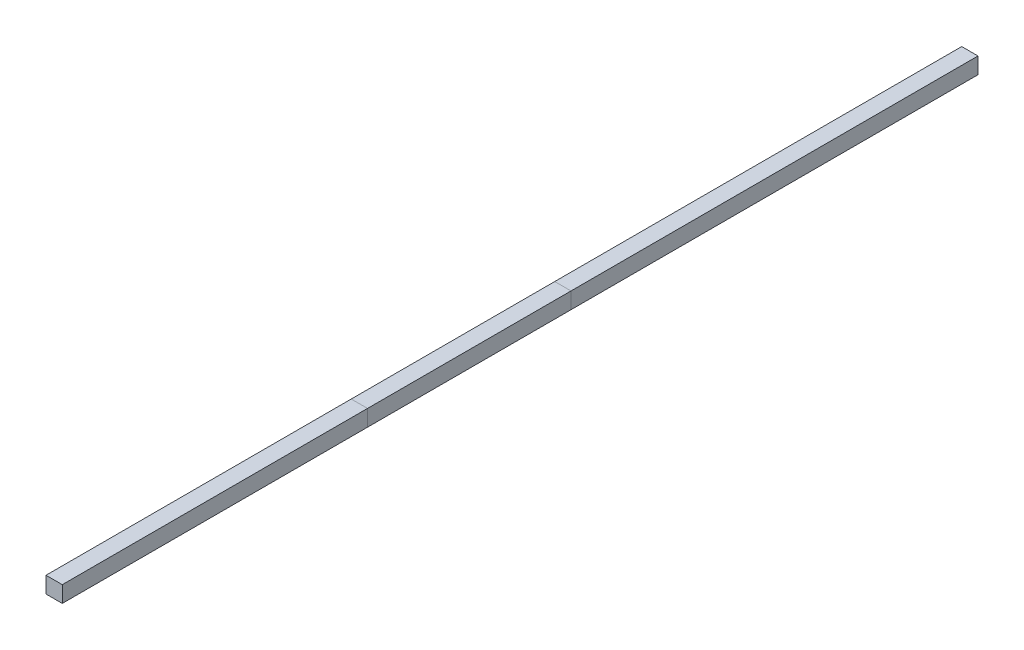
ISO-10303-21;
HEADER;
FILE_DESCRIPTION(('STEP AP214'),'2;1');
FILE_NAME('part.step','',(''),(''),'','','');
FILE_SCHEMA(('AUTOMOTIVE_DESIGN { 1 0 10303 214 1 1 1 1 }'));
ENDSEC;
DATA;
#1=APPLICATION_CONTEXT('core data for automotive mechanical design processes');
#2=APPLICATION_PROTOCOL_DEFINITION('international standard','automotive_design',2000,#1);
#3=PRODUCT_CONTEXT('',#1,'mechanical');
#4=PRODUCT('Part','Part','',(#3));
#5=PRODUCT_RELATED_PRODUCT_CATEGORY('part','',(#4));
#6=PRODUCT_DEFINITION_FORMATION('','',#4);
#7=PRODUCT_DEFINITION_CONTEXT('part definition',#1,'design');
#8=PRODUCT_DEFINITION('design','',#6,#7);
#9=PRODUCT_DEFINITION_SHAPE('','',#8);
#10=(LENGTH_UNIT() NAMED_UNIT(*) SI_UNIT(.MILLI.,.METRE.));
#11=(NAMED_UNIT(*) PLANE_ANGLE_UNIT() SI_UNIT($,.RADIAN.));
#12=(NAMED_UNIT(*) SI_UNIT($,.STERADIAN.) SOLID_ANGLE_UNIT());
#13=UNCERTAINTY_MEASURE_WITH_UNIT(LENGTH_MEASURE(1.E-05),#10,'distance_accuracy_value','');
#14=(GEOMETRIC_REPRESENTATION_CONTEXT(3) GLOBAL_UNCERTAINTY_ASSIGNED_CONTEXT((#13)) GLOBAL_UNIT_ASSIGNED_CONTEXT((#10,
#11,#12)) REPRESENTATION_CONTEXT('',''));
#15=CARTESIAN_POINT('',(0.,0.,0.));
#16=DIRECTION('',(0.,0.,1.));
#17=DIRECTION('',(1.,0.,0.));
#18=AXIS2_PLACEMENT_3D('',#15,#16,#17);
#19=CARTESIAN_POINT('',(0.,0.,4500.));
#20=DIRECTION('',(1.,0.,0.));
#21=DIRECTION('',(0.,1.,0.));
#22=AXIS2_PLACEMENT_3D('',#19,#20,#21);
#23=PLANE('',#22);
#24=DIRECTION('',(0.,-1.,0.));
#25=VECTOR('',#24,1.);
#26=CARTESIAN_POINT('',(0.,0.,3000.));
#27=LINE('',#26,#25);
#28=CARTESIAN_POINT('',(0.,80.,3000.));
#29=VERTEX_POINT('',#28);
#30=CARTESIAN_POINT('',(0.,0.,3000.));
#31=VERTEX_POINT('',#30);
#32=EDGE_CURVE('E113',#29,#31,#27,.T.);
#33=ORIENTED_EDGE('',*,*,#32,.T.);
#34=DIRECTION('',(0.,0.,-1.));
#35=VECTOR('',#34,1.);
#36=CARTESIAN_POINT('',(0.,0.,4500.));
#37=LINE('',#36,#35);
#38=CARTESIAN_POINT('',(0.,0.,4500.));
#39=VERTEX_POINT('',#38);
#40=EDGE_CURVE('E12',#39,#31,#37,.T.);
#41=ORIENTED_EDGE('',*,*,#40,.F.);
#42=DIRECTION('',(0.,-1.,0.));
#43=VECTOR('',#42,1.);
#44=CARTESIAN_POINT('',(0.,0.,4500.));
#45=LINE('',#44,#43);
#46=CARTESIAN_POINT('',(0.,80.,4500.));
#47=VERTEX_POINT('',#46);
#48=EDGE_CURVE('E101',#47,#39,#45,.T.);
#49=ORIENTED_EDGE('',*,*,#48,.F.);
#50=DIRECTION('',(0.,0.,-1.));
#51=VECTOR('',#50,1.);
#52=CARTESIAN_POINT('',(0.,80.,4500.));
#53=LINE('',#52,#51);
#54=EDGE_CURVE('E109',#47,#29,#53,.T.);
#55=ORIENTED_EDGE('',*,*,#54,.T.);
#56=EDGE_LOOP('',(#33,#41,#49,#55));
#57=FACE_BOUND('',#56,.T.);
#58=ADVANCED_FACE('F50',(#57),#23,.F.);
#59=CARTESIAN_POINT('',(0.,0.,4500.));
#60=DIRECTION('',(0.,1.,0.));
#61=DIRECTION('',(0.,0.,1.));
#62=AXIS2_PLACEMENT_3D('',#59,#60,#61);
#63=PLANE('',#62);
#64=DIRECTION('',(1.,0.,0.));
#65=VECTOR('',#64,1.);
#66=CARTESIAN_POINT('',(0.,0.,3000.));
#67=LINE('',#66,#65);
#68=CARTESIAN_POINT('',(80.,0.,3000.));
#69=VERTEX_POINT('',#68);
#70=EDGE_CURVE('E105',#31,#69,#67,.T.);
#71=ORIENTED_EDGE('',*,*,#70,.T.);
#72=DIRECTION('',(0.,0.,-1.));
#73=VECTOR('',#72,1.);
#74=CARTESIAN_POINT('',(80.,0.,4500.));
#75=LINE('',#74,#73);
#76=CARTESIAN_POINT('',(80.,0.,4500.));
#77=VERTEX_POINT('',#76);
#78=EDGE_CURVE('E58',#77,#69,#75,.T.);
#79=ORIENTED_EDGE('',*,*,#78,.F.);
#80=DIRECTION('',(1.,0.,0.));
#81=VECTOR('',#80,1.);
#82=CARTESIAN_POINT('',(0.,0.,4500.));
#83=LINE('',#82,#81);
#84=EDGE_CURVE('E96',#39,#77,#83,.T.);
#85=ORIENTED_EDGE('',*,*,#84,.F.);
#86=ORIENTED_EDGE('',*,*,#40,.T.);
#87=EDGE_LOOP('',(#71,#79,#85,#86));
#88=FACE_BOUND('',#87,.T.);
#89=ADVANCED_FACE('F104',(#88),#63,.F.);
#90=CARTESIAN_POINT('',(80.,0.,4500.));
#91=DIRECTION('',(-1.,0.,0.));
#92=DIRECTION('',(0.,-1.,0.));
#93=AXIS2_PLACEMENT_3D('',#90,#91,#92);
#94=PLANE('',#93);
#95=DIRECTION('',(0.,1.,0.));
#96=VECTOR('',#95,1.);
#97=CARTESIAN_POINT('',(80.,0.,3000.));
#98=LINE('',#97,#96);
#99=CARTESIAN_POINT('',(80.,80.,3000.));
#100=VERTEX_POINT('',#99);
#101=EDGE_CURVE('E83',#69,#100,#98,.T.);
#102=ORIENTED_EDGE('',*,*,#101,.T.);
#103=DIRECTION('',(0.,0.,-1.));
#104=VECTOR('',#103,1.);
#105=CARTESIAN_POINT('',(80.,80.,4500.));
#106=LINE('',#105,#104);
#107=CARTESIAN_POINT('',(80.,80.,4500.));
#108=VERTEX_POINT('',#107);
#109=EDGE_CURVE('E106',#108,#100,#106,.T.);
#110=ORIENTED_EDGE('',*,*,#109,.F.);
#111=DIRECTION('',(0.,1.,0.));
#112=VECTOR('',#111,1.);
#113=CARTESIAN_POINT('',(80.,0.,4500.));
#114=LINE('',#113,#112);
#115=EDGE_CURVE('E99',#77,#108,#114,.T.);
#116=ORIENTED_EDGE('',*,*,#115,.F.);
#117=ORIENTED_EDGE('',*,*,#78,.T.);
#118=EDGE_LOOP('',(#102,#110,#116,#117));
#119=FACE_BOUND('',#118,.T.);
#120=ADVANCED_FACE('F107',(#119),#94,.F.);
#121=CARTESIAN_POINT('',(0.,80.,4500.));
#122=DIRECTION('',(0.,-1.,0.));
#123=DIRECTION('',(0.,0.,-1.));
#124=AXIS2_PLACEMENT_3D('',#121,#122,#123);
#125=PLANE('',#124);
#126=DIRECTION('',(-1.,0.,0.));
#127=VECTOR('',#126,1.);
#128=CARTESIAN_POINT('',(0.,80.,3000.));
#129=LINE('',#128,#127);
#130=EDGE_CURVE('E89',#100,#29,#129,.T.);
#131=ORIENTED_EDGE('',*,*,#130,.T.);
#132=ORIENTED_EDGE('',*,*,#54,.F.);
#133=DIRECTION('',(-1.,0.,0.));
#134=VECTOR('',#133,1.);
#135=CARTESIAN_POINT('',(0.,80.,4500.));
#136=LINE('',#135,#134);
#137=EDGE_CURVE('E66',#108,#47,#136,.T.);
#138=ORIENTED_EDGE('',*,*,#137,.F.);
#139=ORIENTED_EDGE('',*,*,#109,.T.);
#140=EDGE_LOOP('',(#131,#132,#138,#139));
#141=FACE_BOUND('',#140,.T.);
#142=ADVANCED_FACE('F120',(#141),#125,.F.);
#143=CARTESIAN_POINT('',(0.,0.,4500.));
#144=DIRECTION('',(0.,0.,-1.));
#145=DIRECTION('',(-1.,0.,0.));
#146=AXIS2_PLACEMENT_3D('',#143,#144,#145);
#147=PLANE('',#146);
#148=ORIENTED_EDGE('',*,*,#48,.T.);
#149=ORIENTED_EDGE('',*,*,#84,.T.);
#150=ORIENTED_EDGE('',*,*,#115,.T.);
#151=ORIENTED_EDGE('',*,*,#137,.T.);
#152=EDGE_LOOP('',(#148,#149,#150,#151));
#153=FACE_BOUND('',#152,.T.);
#154=ADVANCED_FACE('F97',(#153),#147,.F.);
#155=CARTESIAN_POINT('',(0.,0.,3000.));
#156=DIRECTION('',(0.,0.,-1.));
#157=DIRECTION('',(-1.,0.,0.));
#158=AXIS2_PLACEMENT_3D('',#155,#156,#157);
#159=PLANE('',#158);
#160=ORIENTED_EDGE('',*,*,#32,.F.);
#161=ORIENTED_EDGE('',*,*,#130,.F.);
#162=ORIENTED_EDGE('',*,*,#101,.F.);
#163=ORIENTED_EDGE('',*,*,#70,.F.);
#164=EDGE_LOOP('',(#160,#161,#162,#163));
#165=FACE_BOUND('',#164,.T.);
#166=ADVANCED_FACE('F123',(#165),#159,.T.);
#167=CLOSED_SHELL('',(#58,#89,#120,#142,#154,#166));
#168=MANIFOLD_SOLID_BREP('B2',#167);
#169=CARTESIAN_POINT('',(0.,0.,3000.));
#170=DIRECTION('',(1.,0.,0.));
#171=DIRECTION('',(0.,1.,0.));
#172=AXIS2_PLACEMENT_3D('',#169,#170,#171);
#173=PLANE('',#172);
#174=DIRECTION('',(0.,-1.,0.));
#175=VECTOR('',#174,1.);
#176=CARTESIAN_POINT('',(0.,0.,2000.));
#177=LINE('',#176,#175);
#178=CARTESIAN_POINT('',(0.,80.,2000.));
#179=VERTEX_POINT('',#178);
#180=CARTESIAN_POINT('',(0.,0.,2000.));
#181=VERTEX_POINT('',#180);
#182=EDGE_CURVE('E249',#179,#181,#177,.T.);
#183=ORIENTED_EDGE('',*,*,#182,.T.);
#184=DIRECTION('',(0.,0.,-1.));
#185=VECTOR('',#184,1.);
#186=CARTESIAN_POINT('',(0.,0.,3000.));
#187=LINE('',#186,#185);
#188=CARTESIAN_POINT('',(0.,0.,3000.));
#189=VERTEX_POINT('',#188);
#190=EDGE_CURVE('E48',#189,#181,#187,.T.);
#191=ORIENTED_EDGE('',*,*,#190,.F.);
#192=DIRECTION('',(0.,-1.,0.));
#193=VECTOR('',#192,1.);
#194=CARTESIAN_POINT('',(0.,0.,3000.));
#195=LINE('',#194,#193);
#196=CARTESIAN_POINT('',(0.,80.,3000.));
#197=VERTEX_POINT('',#196);
#198=EDGE_CURVE('E237',#197,#189,#195,.T.);
#199=ORIENTED_EDGE('',*,*,#198,.F.);
#200=DIRECTION('',(0.,0.,-1.));
#201=VECTOR('',#200,1.);
#202=CARTESIAN_POINT('',(0.,80.,3000.));
#203=LINE('',#202,#201);
#204=EDGE_CURVE('E245',#197,#179,#203,.T.);
#205=ORIENTED_EDGE('',*,*,#204,.T.);
#206=EDGE_LOOP('',(#183,#191,#199,#205));
#207=FACE_BOUND('',#206,.T.);
#208=ADVANCED_FACE('F185',(#207),#173,.F.);
#209=CARTESIAN_POINT('',(0.,0.,3000.));
#210=DIRECTION('',(0.,1.,0.));
#211=DIRECTION('',(0.,0.,1.));
#212=AXIS2_PLACEMENT_3D('',#209,#210,#211);
#213=PLANE('',#212);
#214=DIRECTION('',(1.,0.,0.));
#215=VECTOR('',#214,1.);
#216=CARTESIAN_POINT('',(0.,0.,2000.));
#217=LINE('',#216,#215);
#218=CARTESIAN_POINT('',(80.,0.,2000.));
#219=VERTEX_POINT('',#218);
#220=EDGE_CURVE('E241',#181,#219,#217,.T.);
#221=ORIENTED_EDGE('',*,*,#220,.T.);
#222=DIRECTION('',(0.,0.,-1.));
#223=VECTOR('',#222,1.);
#224=CARTESIAN_POINT('',(80.,0.,3000.));
#225=LINE('',#224,#223);
#226=CARTESIAN_POINT('',(80.,0.,3000.));
#227=VERTEX_POINT('',#226);
#228=EDGE_CURVE('E194',#227,#219,#225,.T.);
#229=ORIENTED_EDGE('',*,*,#228,.F.);
#230=DIRECTION('',(1.,0.,0.));
#231=VECTOR('',#230,1.);
#232=CARTESIAN_POINT('',(0.,0.,3000.));
#233=LINE('',#232,#231);
#234=EDGE_CURVE('E232',#189,#227,#233,.T.);
#235=ORIENTED_EDGE('',*,*,#234,.F.);
#236=ORIENTED_EDGE('',*,*,#190,.T.);
#237=EDGE_LOOP('',(#221,#229,#235,#236));
#238=FACE_BOUND('',#237,.T.);
#239=ADVANCED_FACE('F240',(#238),#213,.F.);
#240=CARTESIAN_POINT('',(80.,0.,3000.));
#241=DIRECTION('',(-1.,0.,0.));
#242=DIRECTION('',(0.,-1.,0.));
#243=AXIS2_PLACEMENT_3D('',#240,#241,#242);
#244=PLANE('',#243);
#245=DIRECTION('',(0.,1.,0.));
#246=VECTOR('',#245,1.);
#247=CARTESIAN_POINT('',(80.,0.,2000.));
#248=LINE('',#247,#246);
#249=CARTESIAN_POINT('',(80.,80.,2000.));
#250=VERTEX_POINT('',#249);
#251=EDGE_CURVE('E219',#219,#250,#248,.T.);
#252=ORIENTED_EDGE('',*,*,#251,.T.);
#253=DIRECTION('',(0.,0.,-1.));
#254=VECTOR('',#253,1.);
#255=CARTESIAN_POINT('',(80.,80.,3000.));
#256=LINE('',#255,#254);
#257=CARTESIAN_POINT('',(80.,80.,3000.));
#258=VERTEX_POINT('',#257);
#259=EDGE_CURVE('E242',#258,#250,#256,.T.);
#260=ORIENTED_EDGE('',*,*,#259,.F.);
#261=DIRECTION('',(0.,1.,0.));
#262=VECTOR('',#261,1.);
#263=CARTESIAN_POINT('',(80.,0.,3000.));
#264=LINE('',#263,#262);
#265=EDGE_CURVE('E235',#227,#258,#264,.T.);
#266=ORIENTED_EDGE('',*,*,#265,.F.);
#267=ORIENTED_EDGE('',*,*,#228,.T.);
#268=EDGE_LOOP('',(#252,#260,#266,#267));
#269=FACE_BOUND('',#268,.T.);
#270=ADVANCED_FACE('F243',(#269),#244,.F.);
#271=CARTESIAN_POINT('',(0.,80.,3000.));
#272=DIRECTION('',(0.,-1.,0.));
#273=DIRECTION('',(0.,0.,-1.));
#274=AXIS2_PLACEMENT_3D('',#271,#272,#273);
#275=PLANE('',#274);
#276=DIRECTION('',(-1.,0.,0.));
#277=VECTOR('',#276,1.);
#278=CARTESIAN_POINT('',(0.,80.,2000.));
#279=LINE('',#278,#277);
#280=EDGE_CURVE('E225',#250,#179,#279,.T.);
#281=ORIENTED_EDGE('',*,*,#280,.T.);
#282=ORIENTED_EDGE('',*,*,#204,.F.);
#283=DIRECTION('',(-1.,0.,0.));
#284=VECTOR('',#283,1.);
#285=CARTESIAN_POINT('',(0.,80.,3000.));
#286=LINE('',#285,#284);
#287=EDGE_CURVE('E202',#258,#197,#286,.T.);
#288=ORIENTED_EDGE('',*,*,#287,.F.);
#289=ORIENTED_EDGE('',*,*,#259,.T.);
#290=EDGE_LOOP('',(#281,#282,#288,#289));
#291=FACE_BOUND('',#290,.T.);
#292=ADVANCED_FACE('F269',(#291),#275,.F.);
#293=CARTESIAN_POINT('',(0.,0.,3000.));
#294=DIRECTION('',(0.,0.,-1.));
#295=DIRECTION('',(-1.,0.,0.));
#296=AXIS2_PLACEMENT_3D('',#293,#294,#295);
#297=PLANE('',#296);
#298=ORIENTED_EDGE('',*,*,#198,.T.);
#299=ORIENTED_EDGE('',*,*,#234,.T.);
#300=ORIENTED_EDGE('',*,*,#265,.T.);
#301=ORIENTED_EDGE('',*,*,#287,.T.);
#302=EDGE_LOOP('',(#298,#299,#300,#301));
#303=FACE_BOUND('',#302,.T.);
#304=ADVANCED_FACE('F233',(#303),#297,.F.);
#305=CARTESIAN_POINT('',(0.,0.,2000.));
#306=DIRECTION('',(0.,0.,-1.));
#307=DIRECTION('',(-1.,0.,0.));
#308=AXIS2_PLACEMENT_3D('',#305,#306,#307);
#309=PLANE('',#308);
#310=ORIENTED_EDGE('',*,*,#182,.F.);
#311=ORIENTED_EDGE('',*,*,#280,.F.);
#312=ORIENTED_EDGE('',*,*,#251,.F.);
#313=ORIENTED_EDGE('',*,*,#220,.F.);
#314=EDGE_LOOP('',(#310,#311,#312,#313));
#315=FACE_BOUND('',#314,.T.);
#316=ADVANCED_FACE('F263',(#315),#309,.T.);
#317=CLOSED_SHELL('',(#208,#239,#270,#292,#304,#316));
#318=MANIFOLD_SOLID_BREP('B6',#317);
#319=CARTESIAN_POINT('',(0.,0.,2000.));
#320=DIRECTION('',(1.,0.,0.));
#321=DIRECTION('',(0.,1.,0.));
#322=AXIS2_PLACEMENT_3D('',#319,#320,#321);
#323=PLANE('',#322);
#324=DIRECTION('',(0.,-1.,0.));
#325=VECTOR('',#324,1.);
#326=CARTESIAN_POINT('',(0.,0.,0.));
#327=LINE('',#326,#325);
#328=CARTESIAN_POINT('',(0.,80.,0.));
#329=VERTEX_POINT('',#328);
#330=CARTESIAN_POINT('',(0.,0.,0.));
#331=VERTEX_POINT('',#330);
#332=EDGE_CURVE('E379',#329,#331,#327,.T.);
#333=ORIENTED_EDGE('',*,*,#332,.T.);
#334=DIRECTION('',(0.,0.,-1.));
#335=VECTOR('',#334,1.);
#336=CARTESIAN_POINT('',(0.,0.,2000.));
#337=LINE('',#336,#335);
#338=CARTESIAN_POINT('',(0.,0.,2000.));
#339=VERTEX_POINT('',#338);
#340=EDGE_CURVE('E183',#339,#331,#337,.T.);
#341=ORIENTED_EDGE('',*,*,#340,.F.);
#342=DIRECTION('',(0.,-1.,0.));
#343=VECTOR('',#342,1.);
#344=CARTESIAN_POINT('',(0.,0.,2000.));
#345=LINE('',#344,#343);
#346=CARTESIAN_POINT('',(0.,80.,2000.));
#347=VERTEX_POINT('',#346);
#348=EDGE_CURVE('E367',#347,#339,#345,.T.);
#349=ORIENTED_EDGE('',*,*,#348,.F.);
#350=DIRECTION('',(0.,0.,-1.));
#351=VECTOR('',#350,1.);
#352=CARTESIAN_POINT('',(0.,80.,2000.));
#353=LINE('',#352,#351);
#354=EDGE_CURVE('E375',#347,#329,#353,.T.);
#355=ORIENTED_EDGE('',*,*,#354,.T.);
#356=EDGE_LOOP('',(#333,#341,#349,#355));
#357=FACE_BOUND('',#356,.T.);
#358=ADVANCED_FACE('F315',(#357),#323,.F.);
#359=CARTESIAN_POINT('',(0.,0.,2000.));
#360=DIRECTION('',(0.,1.,0.));
#361=DIRECTION('',(0.,0.,1.));
#362=AXIS2_PLACEMENT_3D('',#359,#360,#361);
#363=PLANE('',#362);
#364=DIRECTION('',(1.,0.,0.));
#365=VECTOR('',#364,1.);
#366=CARTESIAN_POINT('',(0.,0.,0.));
#367=LINE('',#366,#365);
#368=CARTESIAN_POINT('',(80.,0.,0.));
#369=VERTEX_POINT('',#368);
#370=EDGE_CURVE('E371',#331,#369,#367,.T.);
#371=ORIENTED_EDGE('',*,*,#370,.T.);
#372=DIRECTION('',(0.,0.,-1.));
#373=VECTOR('',#372,1.);
#374=CARTESIAN_POINT('',(80.,0.,2000.));
#375=LINE('',#374,#373);
#376=CARTESIAN_POINT('',(80.,0.,2000.));
#377=VERTEX_POINT('',#376);
#378=EDGE_CURVE('E324',#377,#369,#375,.T.);
#379=ORIENTED_EDGE('',*,*,#378,.F.);
#380=DIRECTION('',(1.,0.,0.));
#381=VECTOR('',#380,1.);
#382=CARTESIAN_POINT('',(0.,0.,2000.));
#383=LINE('',#382,#381);
#384=EDGE_CURVE('E362',#339,#377,#383,.T.);
#385=ORIENTED_EDGE('',*,*,#384,.F.);
#386=ORIENTED_EDGE('',*,*,#340,.T.);
#387=EDGE_LOOP('',(#371,#379,#385,#386));
#388=FACE_BOUND('',#387,.T.);
#389=ADVANCED_FACE('F370',(#388),#363,.F.);
#390=CARTESIAN_POINT('',(80.,0.,2000.));
#391=DIRECTION('',(-1.,0.,0.));
#392=DIRECTION('',(0.,-1.,0.));
#393=AXIS2_PLACEMENT_3D('',#390,#391,#392);
#394=PLANE('',#393);
#395=DIRECTION('',(0.,1.,0.));
#396=VECTOR('',#395,1.);
#397=CARTESIAN_POINT('',(80.,0.,0.));
#398=LINE('',#397,#396);
#399=CARTESIAN_POINT('',(80.,80.,0.));
#400=VERTEX_POINT('',#399);
#401=EDGE_CURVE('E349',#369,#400,#398,.T.);
#402=ORIENTED_EDGE('',*,*,#401,.T.);
#403=DIRECTION('',(0.,0.,-1.));
#404=VECTOR('',#403,1.);
#405=CARTESIAN_POINT('',(80.,80.,2000.));
#406=LINE('',#405,#404);
#407=CARTESIAN_POINT('',(80.,80.,2000.));
#408=VERTEX_POINT('',#407);
#409=EDGE_CURVE('E372',#408,#400,#406,.T.);
#410=ORIENTED_EDGE('',*,*,#409,.F.);
#411=DIRECTION('',(0.,1.,0.));
#412=VECTOR('',#411,1.);
#413=CARTESIAN_POINT('',(80.,0.,2000.));
#414=LINE('',#413,#412);
#415=EDGE_CURVE('E365',#377,#408,#414,.T.);
#416=ORIENTED_EDGE('',*,*,#415,.F.);
#417=ORIENTED_EDGE('',*,*,#378,.T.);
#418=EDGE_LOOP('',(#402,#410,#416,#417));
#419=FACE_BOUND('',#418,.T.);
#420=ADVANCED_FACE('F373',(#419),#394,.F.);
#421=CARTESIAN_POINT('',(0.,80.,2000.));
#422=DIRECTION('',(0.,-1.,0.));
#423=DIRECTION('',(0.,0.,-1.));
#424=AXIS2_PLACEMENT_3D('',#421,#422,#423);
#425=PLANE('',#424);
#426=DIRECTION('',(-1.,0.,0.));
#427=VECTOR('',#426,1.);
#428=CARTESIAN_POINT('',(0.,80.,0.));
#429=LINE('',#428,#427);
#430=EDGE_CURVE('E355',#400,#329,#429,.T.);
#431=ORIENTED_EDGE('',*,*,#430,.T.);
#432=ORIENTED_EDGE('',*,*,#354,.F.);
#433=DIRECTION('',(-1.,0.,0.));
#434=VECTOR('',#433,1.);
#435=CARTESIAN_POINT('',(0.,80.,2000.));
#436=LINE('',#435,#434);
#437=EDGE_CURVE('E332',#408,#347,#436,.T.);
#438=ORIENTED_EDGE('',*,*,#437,.F.);
#439=ORIENTED_EDGE('',*,*,#409,.T.);
#440=EDGE_LOOP('',(#431,#432,#438,#439));
#441=FACE_BOUND('',#440,.T.);
#442=ADVANCED_FACE('F390',(#441),#425,.F.);
#443=CARTESIAN_POINT('',(0.,0.,2000.));
#444=DIRECTION('',(0.,0.,-1.));
#445=DIRECTION('',(-1.,0.,0.));
#446=AXIS2_PLACEMENT_3D('',#443,#444,#445);
#447=PLANE('',#446);
#448=ORIENTED_EDGE('',*,*,#348,.T.);
#449=ORIENTED_EDGE('',*,*,#384,.T.);
#450=ORIENTED_EDGE('',*,*,#415,.T.);
#451=ORIENTED_EDGE('',*,*,#437,.T.);
#452=EDGE_LOOP('',(#448,#449,#450,#451));
#453=FACE_BOUND('',#452,.T.);
#454=ADVANCED_FACE('F363',(#453),#447,.F.);
#455=CARTESIAN_POINT('',(0.,0.,0.));
#456=DIRECTION('',(0.,0.,-1.));
#457=DIRECTION('',(-1.,0.,0.));
#458=AXIS2_PLACEMENT_3D('',#455,#456,#457);
#459=PLANE('',#458);
#460=ORIENTED_EDGE('',*,*,#332,.F.);
#461=ORIENTED_EDGE('',*,*,#430,.F.);
#462=ORIENTED_EDGE('',*,*,#401,.F.);
#463=ORIENTED_EDGE('',*,*,#370,.F.);
#464=EDGE_LOOP('',(#460,#461,#462,#463));
#465=FACE_BOUND('',#464,.T.);
#466=ADVANCED_FACE('F393',(#465),#459,.T.);
#467=CLOSED_SHELL('',(#358,#389,#420,#442,#454,#466));
#468=MANIFOLD_SOLID_BREP('B42',#467);
#469=ADVANCED_BREP_SHAPE_REPRESENTATION('',(#18,#168,#318,#468),#14);
#470=SHAPE_DEFINITION_REPRESENTATION(#9,#469);
ENDSEC;
END-ISO-10303-21;
